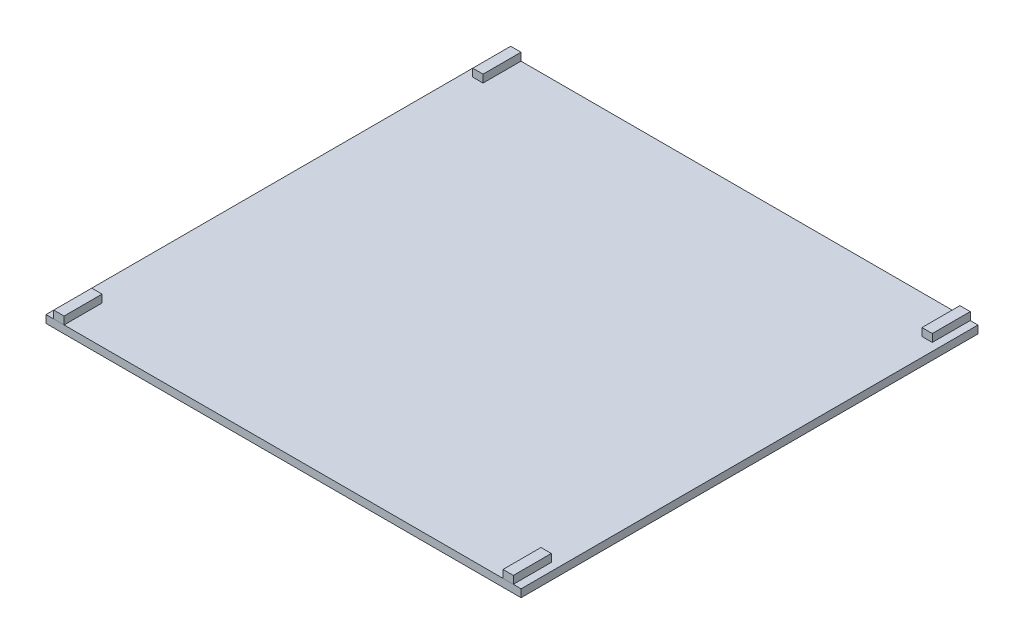
ISO-10303-21;
HEADER;
FILE_DESCRIPTION(('STEP AP214'),'2;1');
FILE_NAME('part.step','',(''),(''),'','','');
FILE_SCHEMA(('AUTOMOTIVE_DESIGN { 1 0 10303 214 1 1 1 1 }'));
ENDSEC;
DATA;
#1=APPLICATION_CONTEXT('core data for automotive mechanical design processes');
#2=APPLICATION_PROTOCOL_DEFINITION('international standard','automotive_design',2000,#1);
#3=PRODUCT_CONTEXT('',#1,'mechanical');
#4=PRODUCT('Part','Part','',(#3));
#5=PRODUCT_RELATED_PRODUCT_CATEGORY('part','',(#4));
#6=PRODUCT_DEFINITION_FORMATION('','',#4);
#7=PRODUCT_DEFINITION_CONTEXT('part definition',#1,'design');
#8=PRODUCT_DEFINITION('design','',#6,#7);
#9=PRODUCT_DEFINITION_SHAPE('','',#8);
#10=(LENGTH_UNIT() NAMED_UNIT(*) SI_UNIT(.MILLI.,.METRE.));
#11=(NAMED_UNIT(*) PLANE_ANGLE_UNIT() SI_UNIT($,.RADIAN.));
#12=(NAMED_UNIT(*) SI_UNIT($,.STERADIAN.) SOLID_ANGLE_UNIT());
#13=UNCERTAINTY_MEASURE_WITH_UNIT(LENGTH_MEASURE(1.E-05),#10,'distance_accuracy_value','');
#14=(GEOMETRIC_REPRESENTATION_CONTEXT(3) GLOBAL_UNCERTAINTY_ASSIGNED_CONTEXT((#13)) GLOBAL_UNIT_ASSIGNED_CONTEXT((#10,
#11,#12)) REPRESENTATION_CONTEXT('',''));
#15=CARTESIAN_POINT('',(0.,0.,0.));
#16=DIRECTION('',(0.,0.,1.));
#17=DIRECTION('',(1.,0.,0.));
#18=AXIS2_PLACEMENT_3D('',#15,#16,#17);
#19=CARTESIAN_POINT('',(44.4999999999999,3.,0.));
#20=DIRECTION('',(-1.,0.,0.));
#21=DIRECTION('',(0.,0.,1.));
#22=AXIS2_PLACEMENT_3D('',#19,#20,#21);
#23=PLANE('',#22);
#24=DIRECTION('',(0.,0.,-1.));
#25=VECTOR('',#24,1.);
#26=CARTESIAN_POINT('',(44.4999999999999,1.5,0.));
#27=LINE('',#26,#25);
#28=CARTESIAN_POINT('',(44.5,1.5,44.245));
#29=VERTEX_POINT('',#28);
#30=CARTESIAN_POINT('',(44.5,1.5,36.890547990223));
#31=VERTEX_POINT('',#30);
#32=EDGE_CURVE('E110',#29,#31,#27,.T.);
#33=ORIENTED_EDGE('',*,*,#32,.T.);
#34=DIRECTION('',(0.,-1.,0.));
#35=VECTOR('',#34,1.);
#36=CARTESIAN_POINT('',(44.5,3.,36.890547990223));
#37=LINE('',#36,#35);
#38=CARTESIAN_POINT('',(44.5,3.,36.890547990223));
#39=VERTEX_POINT('',#38);
#40=EDGE_CURVE('E12',#39,#31,#37,.T.);
#41=ORIENTED_EDGE('',*,*,#40,.F.);
#42=DIRECTION('',(0.,0.,-1.));
#43=VECTOR('',#42,1.);
#44=CARTESIAN_POINT('',(44.4999999999999,3.,0.));
#45=LINE('',#44,#43);
#46=CARTESIAN_POINT('',(44.5,3.,44.245));
#47=VERTEX_POINT('',#46);
#48=EDGE_CURVE('E95',#47,#39,#45,.T.);
#49=ORIENTED_EDGE('',*,*,#48,.F.);
#50=DIRECTION('',(0.,-1.,0.));
#51=VECTOR('',#50,1.);
#52=CARTESIAN_POINT('',(44.5,3.,44.245));
#53=LINE('',#52,#51);
#54=EDGE_CURVE('E106',#47,#29,#53,.T.);
#55=ORIENTED_EDGE('',*,*,#54,.T.);
#56=EDGE_LOOP('',(#33,#41,#49,#55));
#57=FACE_BOUND('',#56,.T.);
#58=ADVANCED_FACE('F48',(#57),#23,.F.);
#59=CARTESIAN_POINT('',(0.,3.,36.890547990223));
#60=DIRECTION('',(0.,0.,1.));
#61=DIRECTION('',(1.,0.,0.));
#62=AXIS2_PLACEMENT_3D('',#59,#60,#61);
#63=PLANE('',#62);
#64=DIRECTION('',(-1.,0.,0.));
#65=VECTOR('',#64,1.);
#66=CARTESIAN_POINT('',(0.,1.5,36.890547990223));
#67=LINE('',#66,#65);
#68=CARTESIAN_POINT('',(42.5,1.5,36.890547990223));
#69=VERTEX_POINT('',#68);
#70=EDGE_CURVE('E100',#31,#69,#67,.T.);
#71=ORIENTED_EDGE('',*,*,#70,.T.);
#72=DIRECTION('',(0.,-1.,0.));
#73=VECTOR('',#72,1.);
#74=CARTESIAN_POINT('',(42.5,3.,36.890547990223));
#75=LINE('',#74,#73);
#76=CARTESIAN_POINT('',(42.5,3.,36.890547990223));
#77=VERTEX_POINT('',#76);
#78=EDGE_CURVE('E56',#77,#69,#75,.T.);
#79=ORIENTED_EDGE('',*,*,#78,.F.);
#80=DIRECTION('',(-1.,0.,0.));
#81=VECTOR('',#80,1.);
#82=CARTESIAN_POINT('',(0.,3.,36.890547990223));
#83=LINE('',#82,#81);
#84=EDGE_CURVE('E90',#39,#77,#83,.T.);
#85=ORIENTED_EDGE('',*,*,#84,.F.);
#86=ORIENTED_EDGE('',*,*,#40,.T.);
#87=EDGE_LOOP('',(#71,#79,#85,#86));
#88=FACE_BOUND('',#87,.T.);
#89=ADVANCED_FACE('F99',(#88),#63,.F.);
#90=CARTESIAN_POINT('',(42.5,3.,0.));
#91=DIRECTION('',(-1.,0.,0.));
#92=DIRECTION('',(0.,0.,1.));
#93=AXIS2_PLACEMENT_3D('',#90,#91,#92);
#94=PLANE('',#93);
#95=DIRECTION('',(0.,0.,-1.));
#96=VECTOR('',#95,1.);
#97=CARTESIAN_POINT('',(42.5,1.5,0.));
#98=LINE('',#97,#96);
#99=CARTESIAN_POINT('',(42.5,1.5,44.245));
#100=VERTEX_POINT('',#99);
#101=EDGE_CURVE('E114',#100,#69,#98,.T.);
#102=ORIENTED_EDGE('',*,*,#101,.F.);
#103=DIRECTION('',(0.,-1.,0.));
#104=VECTOR('',#103,1.);
#105=CARTESIAN_POINT('',(42.5,3.,44.245));
#106=LINE('',#105,#104);
#107=CARTESIAN_POINT('',(42.5,3.,44.245));
#108=VERTEX_POINT('',#107);
#109=EDGE_CURVE('E80',#108,#100,#106,.T.);
#110=ORIENTED_EDGE('',*,*,#109,.F.);
#111=DIRECTION('',(0.,0.,-1.));
#112=VECTOR('',#111,1.);
#113=CARTESIAN_POINT('',(42.5,3.,0.));
#114=LINE('',#113,#112);
#115=EDGE_CURVE('E93',#108,#77,#114,.T.);
#116=ORIENTED_EDGE('',*,*,#115,.T.);
#117=ORIENTED_EDGE('',*,*,#78,.T.);
#118=EDGE_LOOP('',(#102,#110,#116,#117));
#119=FACE_BOUND('',#118,.T.);
#120=ADVANCED_FACE('F104',(#119),#94,.T.);
#121=CARTESIAN_POINT('',(0.,3.,44.245));
#122=DIRECTION('',(0.,0.,-1.));
#123=DIRECTION('',(-1.,0.,0.));
#124=AXIS2_PLACEMENT_3D('',#121,#122,#123);
#125=PLANE('',#124);
#126=DIRECTION('',(1.,0.,0.));
#127=VECTOR('',#126,1.);
#128=CARTESIAN_POINT('',(0.,1.5,44.245));
#129=LINE('',#128,#127);
#130=EDGE_CURVE('E83',#100,#29,#129,.T.);
#131=ORIENTED_EDGE('',*,*,#130,.T.);
#132=ORIENTED_EDGE('',*,*,#54,.F.);
#133=DIRECTION('',(1.,0.,0.));
#134=VECTOR('',#133,1.);
#135=CARTESIAN_POINT('',(0.,3.,44.245));
#136=LINE('',#135,#134);
#137=EDGE_CURVE('E64',#108,#47,#136,.T.);
#138=ORIENTED_EDGE('',*,*,#137,.F.);
#139=ORIENTED_EDGE('',*,*,#109,.T.);
#140=EDGE_LOOP('',(#131,#132,#138,#139));
#141=FACE_BOUND('',#140,.T.);
#142=ADVANCED_FACE('F127',(#141),#125,.F.);
#143=CARTESIAN_POINT('',(0.,3.,0.));
#144=DIRECTION('',(0.,1.,0.));
#145=DIRECTION('',(0.,0.,1.));
#146=AXIS2_PLACEMENT_3D('',#143,#144,#145);
#147=PLANE('',#146);
#148=ORIENTED_EDGE('',*,*,#48,.T.);
#149=ORIENTED_EDGE('',*,*,#84,.T.);
#150=ORIENTED_EDGE('',*,*,#115,.F.);
#151=ORIENTED_EDGE('',*,*,#137,.T.);
#152=EDGE_LOOP('',(#148,#149,#150,#151));
#153=FACE_BOUND('',#152,.T.);
#154=ADVANCED_FACE('F91',(#153),#147,.T.);
#155=CARTESIAN_POINT('',(0.,1.5,0.));
#156=DIRECTION('',(0.,1.,0.));
#157=DIRECTION('',(0.,0.,1.));
#158=AXIS2_PLACEMENT_3D('',#155,#156,#157);
#159=PLANE('',#158);
#160=ORIENTED_EDGE('',*,*,#32,.F.);
#161=ORIENTED_EDGE('',*,*,#130,.F.);
#162=ORIENTED_EDGE('',*,*,#101,.T.);
#163=ORIENTED_EDGE('',*,*,#70,.F.);
#164=EDGE_LOOP('',(#160,#161,#162,#163));
#165=FACE_BOUND('',#164,.T.);
#166=ADVANCED_FACE('F121',(#165),#159,.F.);
#167=CLOSED_SHELL('',(#58,#89,#120,#142,#154,#166));
#168=MANIFOLD_SOLID_BREP('B2',#167);
#169=CARTESIAN_POINT('',(-42.5,3.,0.));
#170=DIRECTION('',(-1.,0.,0.));
#171=DIRECTION('',(0.,0.,1.));
#172=AXIS2_PLACEMENT_3D('',#169,#170,#171);
#173=PLANE('',#172);
#174=DIRECTION('',(0.,0.,-1.));
#175=VECTOR('',#174,1.);
#176=CARTESIAN_POINT('',(-42.5,1.5,0.));
#177=LINE('',#176,#175);
#178=CARTESIAN_POINT('',(-42.5,1.5,44.245));
#179=VERTEX_POINT('',#178);
#180=CARTESIAN_POINT('',(-42.5,1.5,36.890547990223));
#181=VERTEX_POINT('',#180);
#182=EDGE_CURVE('E247',#179,#181,#177,.T.);
#183=ORIENTED_EDGE('',*,*,#182,.T.);
#184=DIRECTION('',(0.,-1.,0.));
#185=VECTOR('',#184,1.);
#186=CARTESIAN_POINT('',(-42.5,3.,36.890547990223));
#187=LINE('',#186,#185);
#188=CARTESIAN_POINT('',(-42.5,3.,36.890547990223));
#189=VERTEX_POINT('',#188);
#190=EDGE_CURVE('E46',#189,#181,#187,.T.);
#191=ORIENTED_EDGE('',*,*,#190,.F.);
#192=DIRECTION('',(0.,0.,-1.));
#193=VECTOR('',#192,1.);
#194=CARTESIAN_POINT('',(-42.5,3.,0.));
#195=LINE('',#194,#193);
#196=CARTESIAN_POINT('',(-42.5,3.,44.245));
#197=VERTEX_POINT('',#196);
#198=EDGE_CURVE('E232',#197,#189,#195,.T.);
#199=ORIENTED_EDGE('',*,*,#198,.F.);
#200=DIRECTION('',(0.,-1.,0.));
#201=VECTOR('',#200,1.);
#202=CARTESIAN_POINT('',(-42.5,3.,44.245));
#203=LINE('',#202,#201);
#204=EDGE_CURVE('E243',#197,#179,#203,.T.);
#205=ORIENTED_EDGE('',*,*,#204,.T.);
#206=EDGE_LOOP('',(#183,#191,#199,#205));
#207=FACE_BOUND('',#206,.T.);
#208=ADVANCED_FACE('F185',(#207),#173,.F.);
#209=CARTESIAN_POINT('',(0.,3.,36.890547990223));
#210=DIRECTION('',(0.,0.,1.));
#211=DIRECTION('',(1.,0.,0.));
#212=AXIS2_PLACEMENT_3D('',#209,#210,#211);
#213=PLANE('',#212);
#214=DIRECTION('',(-1.,0.,0.));
#215=VECTOR('',#214,1.);
#216=CARTESIAN_POINT('',(0.,1.5,36.890547990223));
#217=LINE('',#216,#215);
#218=CARTESIAN_POINT('',(-44.5,1.5,36.890547990223));
#219=VERTEX_POINT('',#218);
#220=EDGE_CURVE('E237',#181,#219,#217,.T.);
#221=ORIENTED_EDGE('',*,*,#220,.T.);
#222=DIRECTION('',(0.,-1.,0.));
#223=VECTOR('',#222,1.);
#224=CARTESIAN_POINT('',(-44.5,3.,36.890547990223));
#225=LINE('',#224,#223);
#226=CARTESIAN_POINT('',(-44.5,3.,36.890547990223));
#227=VERTEX_POINT('',#226);
#228=EDGE_CURVE('E193',#227,#219,#225,.T.);
#229=ORIENTED_EDGE('',*,*,#228,.F.);
#230=DIRECTION('',(-1.,0.,0.));
#231=VECTOR('',#230,1.);
#232=CARTESIAN_POINT('',(0.,3.,36.890547990223));
#233=LINE('',#232,#231);
#234=EDGE_CURVE('E227',#189,#227,#233,.T.);
#235=ORIENTED_EDGE('',*,*,#234,.F.);
#236=ORIENTED_EDGE('',*,*,#190,.T.);
#237=EDGE_LOOP('',(#221,#229,#235,#236));
#238=FACE_BOUND('',#237,.T.);
#239=ADVANCED_FACE('F236',(#238),#213,.F.);
#240=CARTESIAN_POINT('',(-44.5000000000001,3.,0.));
#241=DIRECTION('',(-1.,0.,0.));
#242=DIRECTION('',(0.,0.,1.));
#243=AXIS2_PLACEMENT_3D('',#240,#241,#242);
#244=PLANE('',#243);
#245=DIRECTION('',(0.,0.,-1.));
#246=VECTOR('',#245,1.);
#247=CARTESIAN_POINT('',(-44.5000000000001,1.5,0.));
#248=LINE('',#247,#246);
#249=CARTESIAN_POINT('',(-44.5,1.5,44.245));
#250=VERTEX_POINT('',#249);
#251=EDGE_CURVE('E251',#250,#219,#248,.T.);
#252=ORIENTED_EDGE('',*,*,#251,.F.);
#253=DIRECTION('',(0.,-1.,0.));
#254=VECTOR('',#253,1.);
#255=CARTESIAN_POINT('',(-44.5,3.,44.245));
#256=LINE('',#255,#254);
#257=CARTESIAN_POINT('',(-44.5,3.,44.245));
#258=VERTEX_POINT('',#257);
#259=EDGE_CURVE('E217',#258,#250,#256,.T.);
#260=ORIENTED_EDGE('',*,*,#259,.F.);
#261=DIRECTION('',(0.,0.,-1.));
#262=VECTOR('',#261,1.);
#263=CARTESIAN_POINT('',(-44.5000000000001,3.,0.));
#264=LINE('',#263,#262);
#265=EDGE_CURVE('E230',#258,#227,#264,.T.);
#266=ORIENTED_EDGE('',*,*,#265,.T.);
#267=ORIENTED_EDGE('',*,*,#228,.T.);
#268=EDGE_LOOP('',(#252,#260,#266,#267));
#269=FACE_BOUND('',#268,.T.);
#270=ADVANCED_FACE('F241',(#269),#244,.T.);
#271=CARTESIAN_POINT('',(0.,3.,44.245));
#272=DIRECTION('',(0.,0.,-1.));
#273=DIRECTION('',(-1.,0.,0.));
#274=AXIS2_PLACEMENT_3D('',#271,#272,#273);
#275=PLANE('',#274);
#276=DIRECTION('',(1.,0.,0.));
#277=VECTOR('',#276,1.);
#278=CARTESIAN_POINT('',(0.,1.5,44.245));
#279=LINE('',#278,#277);
#280=EDGE_CURVE('E220',#250,#179,#279,.T.);
#281=ORIENTED_EDGE('',*,*,#280,.T.);
#282=ORIENTED_EDGE('',*,*,#204,.F.);
#283=DIRECTION('',(1.,0.,0.));
#284=VECTOR('',#283,1.);
#285=CARTESIAN_POINT('',(0.,3.,44.245));
#286=LINE('',#285,#284);
#287=EDGE_CURVE('E201',#258,#197,#286,.T.);
#288=ORIENTED_EDGE('',*,*,#287,.F.);
#289=ORIENTED_EDGE('',*,*,#259,.T.);
#290=EDGE_LOOP('',(#281,#282,#288,#289));
#291=FACE_BOUND('',#290,.T.);
#292=ADVANCED_FACE('F264',(#291),#275,.F.);
#293=CARTESIAN_POINT('',(0.,3.,0.));
#294=DIRECTION('',(0.,1.,0.));
#295=DIRECTION('',(0.,0.,1.));
#296=AXIS2_PLACEMENT_3D('',#293,#294,#295);
#297=PLANE('',#296);
#298=ORIENTED_EDGE('',*,*,#198,.T.);
#299=ORIENTED_EDGE('',*,*,#234,.T.);
#300=ORIENTED_EDGE('',*,*,#265,.F.);
#301=ORIENTED_EDGE('',*,*,#287,.T.);
#302=EDGE_LOOP('',(#298,#299,#300,#301));
#303=FACE_BOUND('',#302,.T.);
#304=ADVANCED_FACE('F228',(#303),#297,.T.);
#305=CARTESIAN_POINT('',(0.,1.5,0.));
#306=DIRECTION('',(0.,1.,0.));
#307=DIRECTION('',(0.,0.,1.));
#308=AXIS2_PLACEMENT_3D('',#305,#306,#307);
#309=PLANE('',#308);
#310=ORIENTED_EDGE('',*,*,#182,.F.);
#311=ORIENTED_EDGE('',*,*,#280,.F.);
#312=ORIENTED_EDGE('',*,*,#251,.T.);
#313=ORIENTED_EDGE('',*,*,#220,.F.);
#314=EDGE_LOOP('',(#310,#311,#312,#313));
#315=FACE_BOUND('',#314,.T.);
#316=ADVANCED_FACE('F258',(#315),#309,.F.);
#317=CLOSED_SHELL('',(#208,#239,#270,#292,#304,#316));
#318=MANIFOLD_SOLID_BREP('B6',#317);
#319=CARTESIAN_POINT('',(0.,3.,-36.890547990223));
#320=DIRECTION('',(0.,0.,1.));
#321=DIRECTION('',(1.,0.,0.));
#322=AXIS2_PLACEMENT_3D('',#319,#320,#321);
#323=PLANE('',#322);
#324=DIRECTION('',(-1.,0.,0.));
#325=VECTOR('',#324,1.);
#326=CARTESIAN_POINT('',(0.,1.5,-36.890547990223));
#327=LINE('',#326,#325);
#328=CARTESIAN_POINT('',(-42.5,1.5,-36.890547990223));
#329=VERTEX_POINT('',#328);
#330=CARTESIAN_POINT('',(-44.5,1.5,-36.890547990223));
#331=VERTEX_POINT('',#330);
#332=EDGE_CURVE('E385',#329,#331,#327,.T.);
#333=ORIENTED_EDGE('',*,*,#332,.F.);
#334=DIRECTION('',(0.,-1.,0.));
#335=VECTOR('',#334,1.);
#336=CARTESIAN_POINT('',(-42.5,3.,-36.890547990223));
#337=LINE('',#336,#335);
#338=CARTESIAN_POINT('',(-42.5,3.,-36.890547990223));
#339=VERTEX_POINT('',#338);
#340=EDGE_CURVE('E183',#339,#329,#337,.T.);
#341=ORIENTED_EDGE('',*,*,#340,.F.);
#342=DIRECTION('',(-1.,0.,0.));
#343=VECTOR('',#342,1.);
#344=CARTESIAN_POINT('',(0.,3.,-36.890547990223));
#345=LINE('',#344,#343);
#346=CARTESIAN_POINT('',(-44.5,3.,-36.890547990223));
#347=VERTEX_POINT('',#346);
#348=EDGE_CURVE('E379',#339,#347,#345,.T.);
#349=ORIENTED_EDGE('',*,*,#348,.T.);
#350=DIRECTION('',(0.,-1.,0.));
#351=VECTOR('',#350,1.);
#352=CARTESIAN_POINT('',(-44.5,3.,-36.890547990223));
#353=LINE('',#352,#351);
#354=EDGE_CURVE('E360',#347,#331,#353,.T.);
#355=ORIENTED_EDGE('',*,*,#354,.T.);
#356=EDGE_LOOP('',(#333,#341,#349,#355));
#357=FACE_BOUND('',#356,.T.);
#358=ADVANCED_FACE('F322',(#357),#323,.T.);
#359=CARTESIAN_POINT('',(-42.5,3.,0.));
#360=DIRECTION('',(1.,0.,0.));
#361=DIRECTION('',(0.,0.,-1.));
#362=AXIS2_PLACEMENT_3D('',#359,#360,#361);
#363=PLANE('',#362);
#364=DIRECTION('',(0.,0.,1.));
#365=VECTOR('',#364,1.);
#366=CARTESIAN_POINT('',(-42.5,1.5,0.));
#367=LINE('',#366,#365);
#368=CARTESIAN_POINT('',(-42.5,1.5,-44.245));
#369=VERTEX_POINT('',#368);
#370=EDGE_CURVE('E373',#369,#329,#367,.T.);
#371=ORIENTED_EDGE('',*,*,#370,.F.);
#372=DIRECTION('',(0.,-1.,0.));
#373=VECTOR('',#372,1.);
#374=CARTESIAN_POINT('',(-42.5,3.,-44.245));
#375=LINE('',#374,#373);
#376=CARTESIAN_POINT('',(-42.5,3.,-44.245));
#377=VERTEX_POINT('',#376);
#378=EDGE_CURVE('E330',#377,#369,#375,.T.);
#379=ORIENTED_EDGE('',*,*,#378,.F.);
#380=DIRECTION('',(0.,0.,1.));
#381=VECTOR('',#380,1.);
#382=CARTESIAN_POINT('',(-42.5,3.,0.));
#383=LINE('',#382,#381);
#384=EDGE_CURVE('E371',#377,#339,#383,.T.);
#385=ORIENTED_EDGE('',*,*,#384,.T.);
#386=ORIENTED_EDGE('',*,*,#340,.T.);
#387=EDGE_LOOP('',(#371,#379,#385,#386));
#388=FACE_BOUND('',#387,.T.);
#389=ADVANCED_FACE('F369',(#388),#363,.T.);
#390=CARTESIAN_POINT('',(0.,3.,-44.245));
#391=DIRECTION('',(0.,0.,1.));
#392=DIRECTION('',(1.,0.,0.));
#393=AXIS2_PLACEMENT_3D('',#390,#391,#392);
#394=PLANE('',#393);
#395=DIRECTION('',(-1.,0.,0.));
#396=VECTOR('',#395,1.);
#397=CARTESIAN_POINT('',(0.,1.5,-44.245));
#398=LINE('',#397,#396);
#399=CARTESIAN_POINT('',(-44.5,1.5,-44.245));
#400=VERTEX_POINT('',#399);
#401=EDGE_CURVE('E353',#369,#400,#398,.T.);
#402=ORIENTED_EDGE('',*,*,#401,.T.);
#403=DIRECTION('',(0.,-1.,0.));
#404=VECTOR('',#403,1.);
#405=CARTESIAN_POINT('',(-44.5,3.,-44.245));
#406=LINE('',#405,#404);
#407=CARTESIAN_POINT('',(-44.5,3.,-44.245));
#408=VERTEX_POINT('',#407);
#409=EDGE_CURVE('E374',#408,#400,#406,.T.);
#410=ORIENTED_EDGE('',*,*,#409,.F.);
#411=DIRECTION('',(-1.,0.,0.));
#412=VECTOR('',#411,1.);
#413=CARTESIAN_POINT('',(0.,3.,-44.245));
#414=LINE('',#413,#412);
#415=EDGE_CURVE('E375',#377,#408,#414,.T.);
#416=ORIENTED_EDGE('',*,*,#415,.F.);
#417=ORIENTED_EDGE('',*,*,#378,.T.);
#418=EDGE_LOOP('',(#402,#410,#416,#417));
#419=FACE_BOUND('',#418,.T.);
#420=ADVANCED_FACE('F376',(#419),#394,.F.);
#421=CARTESIAN_POINT('',(-44.5,3.,0.));
#422=DIRECTION('',(1.,0.,0.));
#423=DIRECTION('',(0.,0.,-1.));
#424=AXIS2_PLACEMENT_3D('',#421,#422,#423);
#425=PLANE('',#424);
#426=DIRECTION('',(0.,0.,1.));
#427=VECTOR('',#426,1.);
#428=CARTESIAN_POINT('',(-44.5,1.5,0.));
#429=LINE('',#428,#427);
#430=EDGE_CURVE('E381',#400,#331,#429,.T.);
#431=ORIENTED_EDGE('',*,*,#430,.T.);
#432=ORIENTED_EDGE('',*,*,#354,.F.);
#433=DIRECTION('',(0.,0.,1.));
#434=VECTOR('',#433,1.);
#435=CARTESIAN_POINT('',(-44.5,3.,0.));
#436=LINE('',#435,#434);
#437=EDGE_CURVE('E338',#408,#347,#436,.T.);
#438=ORIENTED_EDGE('',*,*,#437,.F.);
#439=ORIENTED_EDGE('',*,*,#409,.T.);
#440=EDGE_LOOP('',(#431,#432,#438,#439));
#441=FACE_BOUND('',#440,.T.);
#442=ADVANCED_FACE('F394',(#441),#425,.F.);
#443=CARTESIAN_POINT('',(0.,3.,0.));
#444=DIRECTION('',(0.,1.,0.));
#445=DIRECTION('',(0.,0.,1.));
#446=AXIS2_PLACEMENT_3D('',#443,#444,#445);
#447=PLANE('',#446);
#448=ORIENTED_EDGE('',*,*,#348,.F.);
#449=ORIENTED_EDGE('',*,*,#384,.F.);
#450=ORIENTED_EDGE('',*,*,#415,.T.);
#451=ORIENTED_EDGE('',*,*,#437,.T.);
#452=EDGE_LOOP('',(#448,#449,#450,#451));
#453=FACE_BOUND('',#452,.T.);
#454=ADVANCED_FACE('F378',(#453),#447,.T.);
#455=CARTESIAN_POINT('',(0.,1.5,0.));
#456=DIRECTION('',(0.,1.,0.));
#457=DIRECTION('',(0.,0.,1.));
#458=AXIS2_PLACEMENT_3D('',#455,#456,#457);
#459=PLANE('',#458);
#460=ORIENTED_EDGE('',*,*,#332,.T.);
#461=ORIENTED_EDGE('',*,*,#430,.F.);
#462=ORIENTED_EDGE('',*,*,#401,.F.);
#463=ORIENTED_EDGE('',*,*,#370,.T.);
#464=EDGE_LOOP('',(#460,#461,#462,#463));
#465=FACE_BOUND('',#464,.T.);
#466=ADVANCED_FACE('F396',(#465),#459,.F.);
#467=CLOSED_SHELL('',(#358,#389,#420,#442,#454,#466));
#468=MANIFOLD_SOLID_BREP('B40',#467);
#469=CARTESIAN_POINT('',(0.,3.,-36.890547990223));
#470=DIRECTION('',(0.,0.,1.));
#471=DIRECTION('',(1.,0.,0.));
#472=AXIS2_PLACEMENT_3D('',#469,#470,#471);
#473=PLANE('',#472);
#474=DIRECTION('',(-1.,0.,0.));
#475=VECTOR('',#474,1.);
#476=CARTESIAN_POINT('',(0.,1.5,-36.890547990223));
#477=LINE('',#476,#475);
#478=CARTESIAN_POINT('',(44.5,1.5,-36.890547990223));
#479=VERTEX_POINT('',#478);
#480=CARTESIAN_POINT('',(42.5,1.5,-36.890547990223));
#481=VERTEX_POINT('',#480);
#482=EDGE_CURVE('E521',#479,#481,#477,.T.);
#483=ORIENTED_EDGE('',*,*,#482,.F.);
#484=DIRECTION('',(0.,-1.,0.));
#485=VECTOR('',#484,1.);
#486=CARTESIAN_POINT('',(44.5,3.,-36.890547990223));
#487=LINE('',#486,#485);
#488=CARTESIAN_POINT('',(44.5,3.,-36.890547990223));
#489=VERTEX_POINT('',#488);
#490=EDGE_CURVE('E320',#489,#479,#487,.T.);
#491=ORIENTED_EDGE('',*,*,#490,.F.);
#492=DIRECTION('',(-1.,0.,0.));
#493=VECTOR('',#492,1.);
#494=CARTESIAN_POINT('',(0.,3.,-36.890547990223));
#495=LINE('',#494,#493);
#496=CARTESIAN_POINT('',(42.5,3.,-36.890547990223));
#497=VERTEX_POINT('',#496);
#498=EDGE_CURVE('E506',#489,#497,#495,.T.);
#499=ORIENTED_EDGE('',*,*,#498,.T.);
#500=DIRECTION('',(0.,-1.,0.));
#501=VECTOR('',#500,1.);
#502=CARTESIAN_POINT('',(42.5,3.,-36.890547990223));
#503=LINE('',#502,#501);
#504=EDGE_CURVE('E474',#497,#481,#503,.T.);
#505=ORIENTED_EDGE('',*,*,#504,.T.);
#506=EDGE_LOOP('',(#483,#491,#499,#505));
#507=FACE_BOUND('',#506,.T.);
#508=ADVANCED_FACE('F458',(#507),#473,.T.);
#509=CARTESIAN_POINT('',(44.5,3.,0.));
#510=DIRECTION('',(-1.,0.,0.));
#511=DIRECTION('',(0.,0.,1.));
#512=AXIS2_PLACEMENT_3D('',#509,#510,#511);
#513=PLANE('',#512);
#514=DIRECTION('',(0.,0.,-1.));
#515=VECTOR('',#514,1.);
#516=CARTESIAN_POINT('',(44.5,1.5,0.));
#517=LINE('',#516,#515);
#518=CARTESIAN_POINT('',(44.5,1.5,-44.245));
#519=VERTEX_POINT('',#518);
#520=EDGE_CURVE('E512',#479,#519,#517,.T.);
#521=ORIENTED_EDGE('',*,*,#520,.T.);
#522=DIRECTION('',(0.,-1.,0.));
#523=VECTOR('',#522,1.);
#524=CARTESIAN_POINT('',(44.5,3.,-44.245));
#525=LINE('',#524,#523);
#526=CARTESIAN_POINT('',(44.5,3.,-44.245));
#527=VERTEX_POINT('',#526);
#528=EDGE_CURVE('E466',#527,#519,#525,.T.);
#529=ORIENTED_EDGE('',*,*,#528,.F.);
#530=DIRECTION('',(0.,0.,-1.));
#531=VECTOR('',#530,1.);
#532=CARTESIAN_POINT('',(44.5,3.,0.));
#533=LINE('',#532,#531);
#534=EDGE_CURVE('E500',#489,#527,#533,.T.);
#535=ORIENTED_EDGE('',*,*,#534,.F.);
#536=ORIENTED_EDGE('',*,*,#490,.T.);
#537=EDGE_LOOP('',(#521,#529,#535,#536));
#538=FACE_BOUND('',#537,.T.);
#539=ADVANCED_FACE('F510',(#538),#513,.F.);
#540=CARTESIAN_POINT('',(0.,3.,-44.245));
#541=DIRECTION('',(0.,0.,1.));
#542=DIRECTION('',(1.,0.,0.));
#543=AXIS2_PLACEMENT_3D('',#540,#541,#542);
#544=PLANE('',#543);
#545=DIRECTION('',(-1.,0.,0.));
#546=VECTOR('',#545,1.);
#547=CARTESIAN_POINT('',(0.,1.5,-44.245));
#548=LINE('',#547,#546);
#549=CARTESIAN_POINT('',(42.5,1.5,-44.245));
#550=VERTEX_POINT('',#549);
#551=EDGE_CURVE('E524',#519,#550,#548,.T.);
#552=ORIENTED_EDGE('',*,*,#551,.T.);
#553=DIRECTION('',(0.,-1.,0.));
#554=VECTOR('',#553,1.);
#555=CARTESIAN_POINT('',(42.5,3.,-44.245));
#556=LINE('',#555,#554);
#557=CARTESIAN_POINT('',(42.5,3.,-44.245));
#558=VERTEX_POINT('',#557);
#559=EDGE_CURVE('E488',#558,#550,#556,.T.);
#560=ORIENTED_EDGE('',*,*,#559,.F.);
#561=DIRECTION('',(-1.,0.,0.));
#562=VECTOR('',#561,1.);
#563=CARTESIAN_POINT('',(0.,3.,-44.245));
#564=LINE('',#563,#562);
#565=EDGE_CURVE('E505',#527,#558,#564,.T.);
#566=ORIENTED_EDGE('',*,*,#565,.F.);
#567=ORIENTED_EDGE('',*,*,#528,.T.);
#568=EDGE_LOOP('',(#552,#560,#566,#567));
#569=FACE_BOUND('',#568,.T.);
#570=ADVANCED_FACE('F515',(#569),#544,.F.);
#571=CARTESIAN_POINT('',(42.5,3.,0.));
#572=DIRECTION('',(-1.,0.,0.));
#573=DIRECTION('',(0.,0.,1.));
#574=AXIS2_PLACEMENT_3D('',#571,#572,#573);
#575=PLANE('',#574);
#576=DIRECTION('',(0.,0.,-1.));
#577=VECTOR('',#576,1.);
#578=CARTESIAN_POINT('',(42.5,1.5,0.));
#579=LINE('',#578,#577);
#580=EDGE_CURVE('E526',#481,#550,#579,.T.);
#581=ORIENTED_EDGE('',*,*,#580,.F.);
#582=ORIENTED_EDGE('',*,*,#504,.F.);
#583=DIRECTION('',(0.,0.,-1.));
#584=VECTOR('',#583,1.);
#585=CARTESIAN_POINT('',(42.5,3.,0.));
#586=LINE('',#585,#584);
#587=EDGE_CURVE('E516',#497,#558,#586,.T.);
#588=ORIENTED_EDGE('',*,*,#587,.T.);
#589=ORIENTED_EDGE('',*,*,#559,.T.);
#590=EDGE_LOOP('',(#581,#582,#588,#589));
#591=FACE_BOUND('',#590,.T.);
#592=ADVANCED_FACE('F531',(#591),#575,.T.);
#593=CARTESIAN_POINT('',(0.,3.,0.));
#594=DIRECTION('',(0.,1.,0.));
#595=DIRECTION('',(0.,0.,1.));
#596=AXIS2_PLACEMENT_3D('',#593,#594,#595);
#597=PLANE('',#596);
#598=ORIENTED_EDGE('',*,*,#498,.F.);
#599=ORIENTED_EDGE('',*,*,#534,.T.);
#600=ORIENTED_EDGE('',*,*,#565,.T.);
#601=ORIENTED_EDGE('',*,*,#587,.F.);
#602=EDGE_LOOP('',(#598,#599,#600,#601));
#603=FACE_BOUND('',#602,.T.);
#604=ADVANCED_FACE('F502',(#603),#597,.T.);
#605=CARTESIAN_POINT('',(0.,1.5,0.));
#606=DIRECTION('',(0.,1.,0.));
#607=DIRECTION('',(0.,0.,1.));
#608=AXIS2_PLACEMENT_3D('',#605,#606,#607);
#609=PLANE('',#608);
#610=ORIENTED_EDGE('',*,*,#482,.T.);
#611=ORIENTED_EDGE('',*,*,#580,.T.);
#612=ORIENTED_EDGE('',*,*,#551,.F.);
#613=ORIENTED_EDGE('',*,*,#520,.F.);
#614=EDGE_LOOP('',(#610,#611,#612,#613));
#615=FACE_BOUND('',#614,.T.);
#616=ADVANCED_FACE('F538',(#615),#609,.F.);
#617=CLOSED_SHELL('',(#508,#539,#570,#592,#604,#616));
#618=MANIFOLD_SOLID_BREP('B177',#617);
#619=CARTESIAN_POINT('',(-46.,1.5,44.245));
#620=DIRECTION('',(1.,0.,0.));
#621=DIRECTION('',(0.,0.,-1.));
#622=AXIS2_PLACEMENT_3D('',#619,#620,#621);
#623=PLANE('',#622);
#624=DIRECTION('',(0.,0.,1.));
#625=VECTOR('',#624,1.);
#626=CARTESIAN_POINT('',(-46.,0.,44.245));
#627=LINE('',#626,#625);
#628=CARTESIAN_POINT('',(-46.,0.,-44.245));
#629=VERTEX_POINT('',#628);
#630=CARTESIAN_POINT('',(-46.,0.,44.245));
#631=VERTEX_POINT('',#630);
#632=EDGE_CURVE('E647',#629,#631,#627,.T.);
#633=ORIENTED_EDGE('',*,*,#632,.T.);
#634=DIRECTION('',(0.,-1.,0.));
#635=VECTOR('',#634,1.);
#636=CARTESIAN_POINT('',(-46.,1.5,44.245));
#637=LINE('',#636,#635);
#638=CARTESIAN_POINT('',(-46.,1.5,44.245));
#639=VERTEX_POINT('',#638);
#640=EDGE_CURVE('E456',#639,#631,#637,.T.);
#641=ORIENTED_EDGE('',*,*,#640,.F.);
#642=DIRECTION('',(0.,0.,1.));
#643=VECTOR('',#642,1.);
#644=CARTESIAN_POINT('',(-46.,1.5,44.245));
#645=LINE('',#644,#643);
#646=CARTESIAN_POINT('',(-46.,1.5,-44.245));
#647=VERTEX_POINT('',#646);
#648=EDGE_CURVE('E635',#647,#639,#645,.T.);
#649=ORIENTED_EDGE('',*,*,#648,.F.);
#650=DIRECTION('',(0.,-1.,0.));
#651=VECTOR('',#650,1.);
#652=CARTESIAN_POINT('',(-46.,1.5,-44.245));
#653=LINE('',#652,#651);
#654=EDGE_CURVE('E643',#647,#629,#653,.T.);
#655=ORIENTED_EDGE('',*,*,#654,.T.);
#656=EDGE_LOOP('',(#633,#641,#649,#655));
#657=FACE_BOUND('',#656,.T.);
#658=ADVANCED_FACE('F584',(#657),#623,.F.);
#659=CARTESIAN_POINT('',(46.,1.5,44.245));
#660=DIRECTION('',(0.,0.,-1.));
#661=DIRECTION('',(-1.,0.,0.));
#662=AXIS2_PLACEMENT_3D('',#659,#660,#661);
#663=PLANE('',#662);
#664=DIRECTION('',(1.,0.,0.));
#665=VECTOR('',#664,1.);
#666=CARTESIAN_POINT('',(46.,0.,44.245));
#667=LINE('',#666,#665);
#668=CARTESIAN_POINT('',(46.,0.,44.245));
#669=VERTEX_POINT('',#668);
#670=EDGE_CURVE('E639',#631,#669,#667,.T.);
#671=ORIENTED_EDGE('',*,*,#670,.T.);
#672=DIRECTION('',(0.,-1.,0.));
#673=VECTOR('',#672,1.);
#674=CARTESIAN_POINT('',(46.,1.5,44.245));
#675=LINE('',#674,#673);
#676=CARTESIAN_POINT('',(46.,1.5,44.245));
#677=VERTEX_POINT('',#676);
#678=EDGE_CURVE('E592',#677,#669,#675,.T.);
#679=ORIENTED_EDGE('',*,*,#678,.F.);
#680=DIRECTION('',(1.,0.,0.));
#681=VECTOR('',#680,1.);
#682=CARTESIAN_POINT('',(46.,1.5,44.245));
#683=LINE('',#682,#681);
#684=EDGE_CURVE('E630',#639,#677,#683,.T.);
#685=ORIENTED_EDGE('',*,*,#684,.F.);
#686=ORIENTED_EDGE('',*,*,#640,.T.);
#687=EDGE_LOOP('',(#671,#679,#685,#686));
#688=FACE_BOUND('',#687,.T.);
#689=ADVANCED_FACE('F638',(#688),#663,.F.);
#690=CARTESIAN_POINT('',(46.,1.5,44.245));
#691=DIRECTION('',(-1.,0.,0.));
#692=DIRECTION('',(0.,0.,1.));
#693=AXIS2_PLACEMENT_3D('',#690,#691,#692);
#694=PLANE('',#693);
#695=DIRECTION('',(0.,0.,-1.));
#696=VECTOR('',#695,1.);
#697=CARTESIAN_POINT('',(46.,0.,44.245));
#698=LINE('',#697,#696);
#699=CARTESIAN_POINT('',(46.,0.,-44.245));
#700=VERTEX_POINT('',#699);
#701=EDGE_CURVE('E617',#669,#700,#698,.T.);
#702=ORIENTED_EDGE('',*,*,#701,.T.);
#703=DIRECTION('',(0.,-1.,0.));
#704=VECTOR('',#703,1.);
#705=CARTESIAN_POINT('',(46.,1.5,-44.245));
#706=LINE('',#705,#704);
#707=CARTESIAN_POINT('',(46.,1.5,-44.245));
#708=VERTEX_POINT('',#707);
#709=EDGE_CURVE('E640',#708,#700,#706,.T.);
#710=ORIENTED_EDGE('',*,*,#709,.F.);
#711=DIRECTION('',(0.,0.,-1.));
#712=VECTOR('',#711,1.);
#713=CARTESIAN_POINT('',(46.,1.5,44.245));
#714=LINE('',#713,#712);
#715=EDGE_CURVE('E633',#677,#708,#714,.T.);
#716=ORIENTED_EDGE('',*,*,#715,.F.);
#717=ORIENTED_EDGE('',*,*,#678,.T.);
#718=EDGE_LOOP('',(#702,#710,#716,#717));
#719=FACE_BOUND('',#718,.T.);
#720=ADVANCED_FACE('F641',(#719),#694,.F.);
#721=CARTESIAN_POINT('',(46.,1.5,-44.245));
#722=DIRECTION('',(0.,0.,1.));
#723=DIRECTION('',(1.,0.,0.));
#724=AXIS2_PLACEMENT_3D('',#721,#722,#723);
#725=PLANE('',#724);
#726=DIRECTION('',(-1.,0.,0.));
#727=VECTOR('',#726,1.);
#728=CARTESIAN_POINT('',(46.,0.,-44.245));
#729=LINE('',#728,#727);
#730=EDGE_CURVE('E623',#700,#629,#729,.T.);
#731=ORIENTED_EDGE('',*,*,#730,.T.);
#732=ORIENTED_EDGE('',*,*,#654,.F.);
#733=DIRECTION('',(-1.,0.,0.));
#734=VECTOR('',#733,1.);
#735=CARTESIAN_POINT('',(46.,1.5,-44.245));
#736=LINE('',#735,#734);
#737=EDGE_CURVE('E600',#708,#647,#736,.T.);
#738=ORIENTED_EDGE('',*,*,#737,.F.);
#739=ORIENTED_EDGE('',*,*,#709,.T.);
#740=EDGE_LOOP('',(#731,#732,#738,#739));
#741=FACE_BOUND('',#740,.T.);
#742=ADVANCED_FACE('F654',(#741),#725,.F.);
#743=CARTESIAN_POINT('',(0.,1.5,0.));
#744=DIRECTION('',(0.,1.,0.));
#745=DIRECTION('',(0.,0.,1.));
#746=AXIS2_PLACEMENT_3D('',#743,#744,#745);
#747=PLANE('',#746);
#748=ORIENTED_EDGE('',*,*,#648,.T.);
#749=ORIENTED_EDGE('',*,*,#684,.T.);
#750=ORIENTED_EDGE('',*,*,#715,.T.);
#751=ORIENTED_EDGE('',*,*,#737,.T.);
#752=EDGE_LOOP('',(#748,#749,#750,#751));
#753=FACE_BOUND('',#752,.T.);
#754=ADVANCED_FACE('F631',(#753),#747,.T.);
#755=CARTESIAN_POINT('',(0.,0.,0.));
#756=DIRECTION('',(0.,1.,0.));
#757=DIRECTION('',(0.,0.,1.));
#758=AXIS2_PLACEMENT_3D('',#755,#756,#757);
#759=PLANE('',#758);
#760=ORIENTED_EDGE('',*,*,#632,.F.);
#761=ORIENTED_EDGE('',*,*,#730,.F.);
#762=ORIENTED_EDGE('',*,*,#701,.F.);
#763=ORIENTED_EDGE('',*,*,#670,.F.);
#764=EDGE_LOOP('',(#760,#761,#762,#763));
#765=FACE_BOUND('',#764,.T.);
#766=ADVANCED_FACE('F657',(#765),#759,.F.);
#767=CLOSED_SHELL('',(#658,#689,#720,#742,#754,#766));
#768=MANIFOLD_SOLID_BREP('B314',#767);
#769=ADVANCED_BREP_SHAPE_REPRESENTATION('',(#18,#168,#318,#468,#618,#768),#14);
#770=SHAPE_DEFINITION_REPRESENTATION(#9,#769);
ENDSEC;
END-ISO-10303-21;
